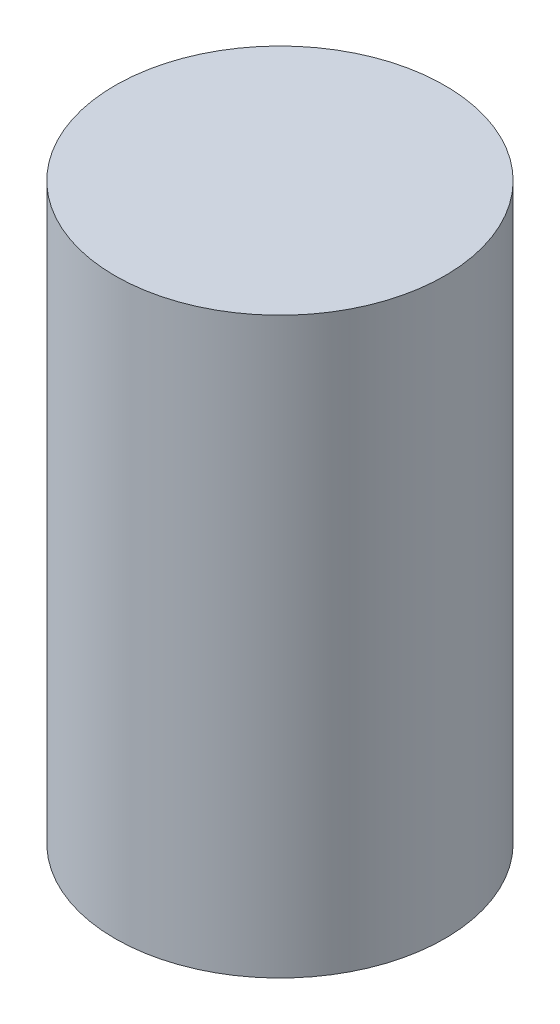
ISO-10303-21;
HEADER;
FILE_DESCRIPTION(('STEP AP214'),'2;1');
FILE_NAME('part.step','',(''),(''),'','','');
FILE_SCHEMA(('AUTOMOTIVE_DESIGN { 1 0 10303 214 1 1 1 1 }'));
ENDSEC;
DATA;
#1=APPLICATION_CONTEXT('core data for automotive mechanical design processes');
#2=APPLICATION_PROTOCOL_DEFINITION('international standard','automotive_design',2000,#1);
#3=PRODUCT_CONTEXT('',#1,'mechanical');
#4=PRODUCT('Part','Part','',(#3));
#5=PRODUCT_RELATED_PRODUCT_CATEGORY('part','',(#4));
#6=PRODUCT_DEFINITION_FORMATION('','',#4);
#7=PRODUCT_DEFINITION_CONTEXT('part definition',#1,'design');
#8=PRODUCT_DEFINITION('design','',#6,#7);
#9=PRODUCT_DEFINITION_SHAPE('','',#8);
#10=(LENGTH_UNIT() NAMED_UNIT(*) SI_UNIT(.MILLI.,.METRE.));
#11=(NAMED_UNIT(*) PLANE_ANGLE_UNIT() SI_UNIT($,.RADIAN.));
#12=(NAMED_UNIT(*) SI_UNIT($,.STERADIAN.) SOLID_ANGLE_UNIT());
#13=UNCERTAINTY_MEASURE_WITH_UNIT(LENGTH_MEASURE(1.E-05),#10,'distance_accuracy_value','');
#14=(GEOMETRIC_REPRESENTATION_CONTEXT(3) GLOBAL_UNCERTAINTY_ASSIGNED_CONTEXT((#13)) GLOBAL_UNIT_ASSIGNED_CONTEXT((#10,
#11,#12)) REPRESENTATION_CONTEXT('',''));
#15=CARTESIAN_POINT('',(0.,0.,0.));
#16=DIRECTION('',(0.,0.,1.));
#17=DIRECTION('',(1.,0.,0.));
#18=AXIS2_PLACEMENT_3D('',#15,#16,#17);
#19=CARTESIAN_POINT('',(0.,55.,0.));
#20=DIRECTION('',(0.,-1.,0.));
#21=DIRECTION('',(0.,0.,-1.));
#22=AXIS2_PLACEMENT_3D('',#19,#20,#21);
#23=CYLINDRICAL_SURFACE('',#22,15.8);
#24=CARTESIAN_POINT('',(0.,55.,0.));
#25=DIRECTION('',(0.,1.,0.));
#26=DIRECTION('',(0.,0.,1.));
#27=AXIS2_PLACEMENT_3D('',#24,#25,#26);
#28=CIRCLE('',#27,15.8);
#29=CARTESIAN_POINT('',(0.,55.,15.8));
#30=VERTEX_POINT('',#29);
#31=EDGE_CURVE('E10',#30,#30,#28,.T.);
#32=ORIENTED_EDGE('',*,*,#31,.F.);
#33=EDGE_LOOP('',(#32));
#34=FACE_BOUND('',#33,.T.);
#35=CARTESIAN_POINT('',(0.,0.,0.));
#36=DIRECTION('',(0.,1.,0.));
#37=DIRECTION('',(0.,0.,1.));
#38=AXIS2_PLACEMENT_3D('',#35,#36,#37);
#39=CIRCLE('',#38,15.8);
#40=CARTESIAN_POINT('',(0.,0.,15.8));
#41=VERTEX_POINT('',#40);
#42=EDGE_CURVE('E38',#41,#41,#39,.T.);
#43=ORIENTED_EDGE('',*,*,#42,.T.);
#44=EDGE_LOOP('',(#43));
#45=FACE_BOUND('',#44,.T.);
#46=ADVANCED_FACE('F35',(#34,#45),#23,.T.);
#47=CARTESIAN_POINT('',(0.,55.,0.));
#48=DIRECTION('',(0.,1.,0.));
#49=DIRECTION('',(0.,0.,1.));
#50=AXIS2_PLACEMENT_3D('',#47,#48,#49);
#51=PLANE('',#50);
#52=ORIENTED_EDGE('',*,*,#31,.T.);
#53=EDGE_LOOP('',(#52));
#54=FACE_BOUND('',#53,.T.);
#55=ADVANCED_FACE('F50',(#54),#51,.T.);
#56=CARTESIAN_POINT('',(0.,0.,0.));
#57=DIRECTION('',(0.,1.,0.));
#58=DIRECTION('',(0.,0.,1.));
#59=AXIS2_PLACEMENT_3D('',#56,#57,#58);
#60=PLANE('',#59);
#61=ORIENTED_EDGE('',*,*,#42,.F.);
#62=EDGE_LOOP('',(#61));
#63=FACE_BOUND('',#62,.T.);
#64=ADVANCED_FACE('F48',(#63),#60,.F.);
#65=CLOSED_SHELL('',(#46,#55,#64));
#66=MANIFOLD_SOLID_BREP('B2',#65);
#67=ADVANCED_BREP_SHAPE_REPRESENTATION('',(#18,#66),#14);
#68=SHAPE_DEFINITION_REPRESENTATION(#9,#67);
ENDSEC;
END-ISO-10303-21;
